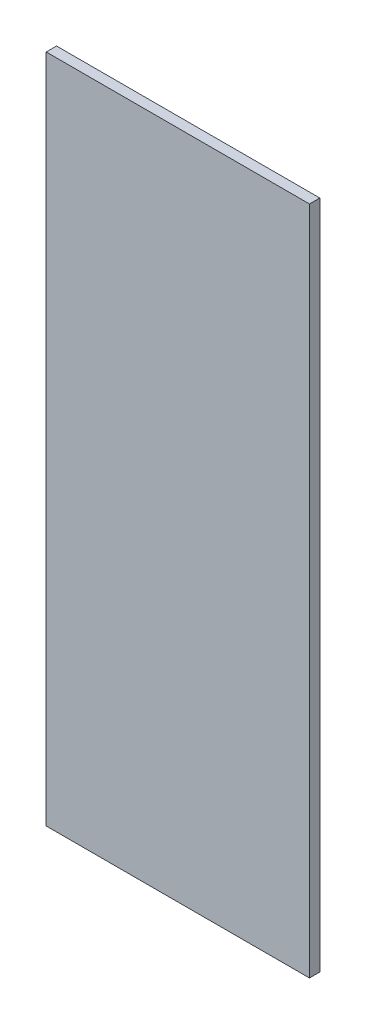
ISO-10303-21;
HEADER;
FILE_DESCRIPTION(('STEP AP214'),'2;1');
FILE_NAME('part.step','',(''),(''),'','','');
FILE_SCHEMA(('AUTOMOTIVE_DESIGN { 1 0 10303 214 1 1 1 1 }'));
ENDSEC;
DATA;
#1=APPLICATION_CONTEXT('core data for automotive mechanical design processes');
#2=APPLICATION_PROTOCOL_DEFINITION('international standard','automotive_design',2000,#1);
#3=PRODUCT_CONTEXT('',#1,'mechanical');
#4=PRODUCT('Part','Part','',(#3));
#5=PRODUCT_RELATED_PRODUCT_CATEGORY('part','',(#4));
#6=PRODUCT_DEFINITION_FORMATION('','',#4);
#7=PRODUCT_DEFINITION_CONTEXT('part definition',#1,'design');
#8=PRODUCT_DEFINITION('design','',#6,#7);
#9=PRODUCT_DEFINITION_SHAPE('','',#8);
#10=(LENGTH_UNIT() NAMED_UNIT(*) SI_UNIT(.MILLI.,.METRE.));
#11=(NAMED_UNIT(*) PLANE_ANGLE_UNIT() SI_UNIT($,.RADIAN.));
#12=(NAMED_UNIT(*) SI_UNIT($,.STERADIAN.) SOLID_ANGLE_UNIT());
#13=UNCERTAINTY_MEASURE_WITH_UNIT(LENGTH_MEASURE(1.E-05),#10,'distance_accuracy_value','');
#14=(GEOMETRIC_REPRESENTATION_CONTEXT(3) GLOBAL_UNCERTAINTY_ASSIGNED_CONTEXT((#13)) GLOBAL_UNIT_ASSIGNED_CONTEXT((#10,
#11,#12)) REPRESENTATION_CONTEXT('',''));
#15=CARTESIAN_POINT('',(0.,0.,0.));
#16=DIRECTION('',(0.,0.,1.));
#17=DIRECTION('',(1.,0.,0.));
#18=AXIS2_PLACEMENT_3D('',#15,#16,#17);
#19=CARTESIAN_POINT('',(324.,-825.,25.4));
#20=DIRECTION('',(-1.,0.,0.));
#21=DIRECTION('',(0.,0.,1.));
#22=AXIS2_PLACEMENT_3D('',#19,#20,#21);
#23=PLANE('',#22);
#24=DIRECTION('',(0.,1.,0.));
#25=VECTOR('',#24,1.);
#26=CARTESIAN_POINT('',(324.,-825.,0.));
#27=LINE('',#26,#25);
#28=CARTESIAN_POINT('',(324.,-825.,0.));
#29=VERTEX_POINT('',#28);
#30=CARTESIAN_POINT('',(324.,825.,0.));
#31=VERTEX_POINT('',#30);
#32=EDGE_CURVE('E102',#29,#31,#27,.T.);
#33=ORIENTED_EDGE('',*,*,#32,.T.);
#34=DIRECTION('',(0.,0.,-1.));
#35=VECTOR('',#34,1.);
#36=CARTESIAN_POINT('',(324.,825.,25.4));
#37=LINE('',#36,#35);
#38=CARTESIAN_POINT('',(324.,825.,25.4));
#39=VERTEX_POINT('',#38);
#40=EDGE_CURVE('E11',#39,#31,#37,.T.);
#41=ORIENTED_EDGE('',*,*,#40,.F.);
#42=DIRECTION('',(0.,1.,0.));
#43=VECTOR('',#42,1.);
#44=CARTESIAN_POINT('',(324.,-825.,25.4));
#45=LINE('',#44,#43);
#46=CARTESIAN_POINT('',(324.,-825.,25.4));
#47=VERTEX_POINT('',#46);
#48=EDGE_CURVE('E90',#47,#39,#45,.T.);
#49=ORIENTED_EDGE('',*,*,#48,.F.);
#50=DIRECTION('',(0.,0.,-1.));
#51=VECTOR('',#50,1.);
#52=CARTESIAN_POINT('',(324.,-825.,25.4));
#53=LINE('',#52,#51);
#54=EDGE_CURVE('E98',#47,#29,#53,.T.);
#55=ORIENTED_EDGE('',*,*,#54,.T.);
#56=EDGE_LOOP('',(#33,#41,#49,#55));
#57=FACE_BOUND('',#56,.T.);
#58=ADVANCED_FACE('F39',(#57),#23,.F.);
#59=CARTESIAN_POINT('',(-324.,825.,25.4));
#60=DIRECTION('',(0.,-1.,0.));
#61=DIRECTION('',(0.,0.,-1.));
#62=AXIS2_PLACEMENT_3D('',#59,#60,#61);
#63=PLANE('',#62);
#64=DIRECTION('',(-1.,0.,0.));
#65=VECTOR('',#64,1.);
#66=CARTESIAN_POINT('',(-324.,825.,0.));
#67=LINE('',#66,#65);
#68=CARTESIAN_POINT('',(-324.,825.,0.));
#69=VERTEX_POINT('',#68);
#70=EDGE_CURVE('E94',#31,#69,#67,.T.);
#71=ORIENTED_EDGE('',*,*,#70,.T.);
#72=DIRECTION('',(0.,0.,-1.));
#73=VECTOR('',#72,1.);
#74=CARTESIAN_POINT('',(-324.,825.,25.4));
#75=LINE('',#74,#73);
#76=CARTESIAN_POINT('',(-324.,825.,25.4));
#77=VERTEX_POINT('',#76);
#78=EDGE_CURVE('E47',#77,#69,#75,.T.);
#79=ORIENTED_EDGE('',*,*,#78,.F.);
#80=DIRECTION('',(-1.,0.,0.));
#81=VECTOR('',#80,1.);
#82=CARTESIAN_POINT('',(-324.,825.,25.4));
#83=LINE('',#82,#81);
#84=EDGE_CURVE('E85',#39,#77,#83,.T.);
#85=ORIENTED_EDGE('',*,*,#84,.F.);
#86=ORIENTED_EDGE('',*,*,#40,.T.);
#87=EDGE_LOOP('',(#71,#79,#85,#86));
#88=FACE_BOUND('',#87,.T.);
#89=ADVANCED_FACE('F93',(#88),#63,.F.);
#90=CARTESIAN_POINT('',(-324.,-825.,25.4));
#91=DIRECTION('',(1.,0.,0.));
#92=DIRECTION('',(0.,0.,-1.));
#93=AXIS2_PLACEMENT_3D('',#90,#91,#92);
#94=PLANE('',#93);
#95=DIRECTION('',(0.,-1.,0.));
#96=VECTOR('',#95,1.);
#97=CARTESIAN_POINT('',(-324.,-825.,0.));
#98=LINE('',#97,#96);
#99=CARTESIAN_POINT('',(-324.,-825.,0.));
#100=VERTEX_POINT('',#99);
#101=EDGE_CURVE('E72',#69,#100,#98,.T.);
#102=ORIENTED_EDGE('',*,*,#101,.T.);
#103=DIRECTION('',(0.,0.,-1.));
#104=VECTOR('',#103,1.);
#105=CARTESIAN_POINT('',(-324.,-825.,25.4));
#106=LINE('',#105,#104);
#107=CARTESIAN_POINT('',(-324.,-825.,25.4));
#108=VERTEX_POINT('',#107);
#109=EDGE_CURVE('E95',#108,#100,#106,.T.);
#110=ORIENTED_EDGE('',*,*,#109,.F.);
#111=DIRECTION('',(0.,-1.,0.));
#112=VECTOR('',#111,1.);
#113=CARTESIAN_POINT('',(-324.,-825.,25.4));
#114=LINE('',#113,#112);
#115=EDGE_CURVE('E88',#77,#108,#114,.T.);
#116=ORIENTED_EDGE('',*,*,#115,.F.);
#117=ORIENTED_EDGE('',*,*,#78,.T.);
#118=EDGE_LOOP('',(#102,#110,#116,#117));
#119=FACE_BOUND('',#118,.T.);
#120=ADVANCED_FACE('F96',(#119),#94,.F.);
#121=CARTESIAN_POINT('',(-324.,-825.,25.4));
#122=DIRECTION('',(0.,1.,0.));
#123=DIRECTION('',(0.,0.,1.));
#124=AXIS2_PLACEMENT_3D('',#121,#122,#123);
#125=PLANE('',#124);
#126=DIRECTION('',(1.,0.,0.));
#127=VECTOR('',#126,1.);
#128=CARTESIAN_POINT('',(-324.,-825.,0.));
#129=LINE('',#128,#127);
#130=EDGE_CURVE('E78',#100,#29,#129,.T.);
#131=ORIENTED_EDGE('',*,*,#130,.T.);
#132=ORIENTED_EDGE('',*,*,#54,.F.);
#133=DIRECTION('',(1.,0.,0.));
#134=VECTOR('',#133,1.);
#135=CARTESIAN_POINT('',(-324.,-825.,25.4));
#136=LINE('',#135,#134);
#137=EDGE_CURVE('E55',#108,#47,#136,.T.);
#138=ORIENTED_EDGE('',*,*,#137,.F.);
#139=ORIENTED_EDGE('',*,*,#109,.T.);
#140=EDGE_LOOP('',(#131,#132,#138,#139));
#141=FACE_BOUND('',#140,.T.);
#142=ADVANCED_FACE('F109',(#141),#125,.F.);
#143=CARTESIAN_POINT('',(0.,0.,25.4));
#144=DIRECTION('',(0.,0.,-1.));
#145=DIRECTION('',(-1.,0.,0.));
#146=AXIS2_PLACEMENT_3D('',#143,#144,#145);
#147=PLANE('',#146);
#148=ORIENTED_EDGE('',*,*,#48,.T.);
#149=ORIENTED_EDGE('',*,*,#84,.T.);
#150=ORIENTED_EDGE('',*,*,#115,.T.);
#151=ORIENTED_EDGE('',*,*,#137,.T.);
#152=EDGE_LOOP('',(#148,#149,#150,#151));
#153=FACE_BOUND('',#152,.T.);
#154=ADVANCED_FACE('F86',(#153),#147,.F.);
#155=CARTESIAN_POINT('',(0.,0.,0.));
#156=DIRECTION('',(0.,0.,-1.));
#157=DIRECTION('',(-1.,0.,0.));
#158=AXIS2_PLACEMENT_3D('',#155,#156,#157);
#159=PLANE('',#158);
#160=ORIENTED_EDGE('',*,*,#32,.F.);
#161=ORIENTED_EDGE('',*,*,#130,.F.);
#162=ORIENTED_EDGE('',*,*,#101,.F.);
#163=ORIENTED_EDGE('',*,*,#70,.F.);
#164=EDGE_LOOP('',(#160,#161,#162,#163));
#165=FACE_BOUND('',#164,.T.);
#166=ADVANCED_FACE('F112',(#165),#159,.T.);
#167=CLOSED_SHELL('',(#58,#89,#120,#142,#154,#166));
#168=MANIFOLD_SOLID_BREP('B2',#167);
#169=ADVANCED_BREP_SHAPE_REPRESENTATION('',(#18,#168),#14);
#170=SHAPE_DEFINITION_REPRESENTATION(#9,#169);
ENDSEC;
END-ISO-10303-21;
